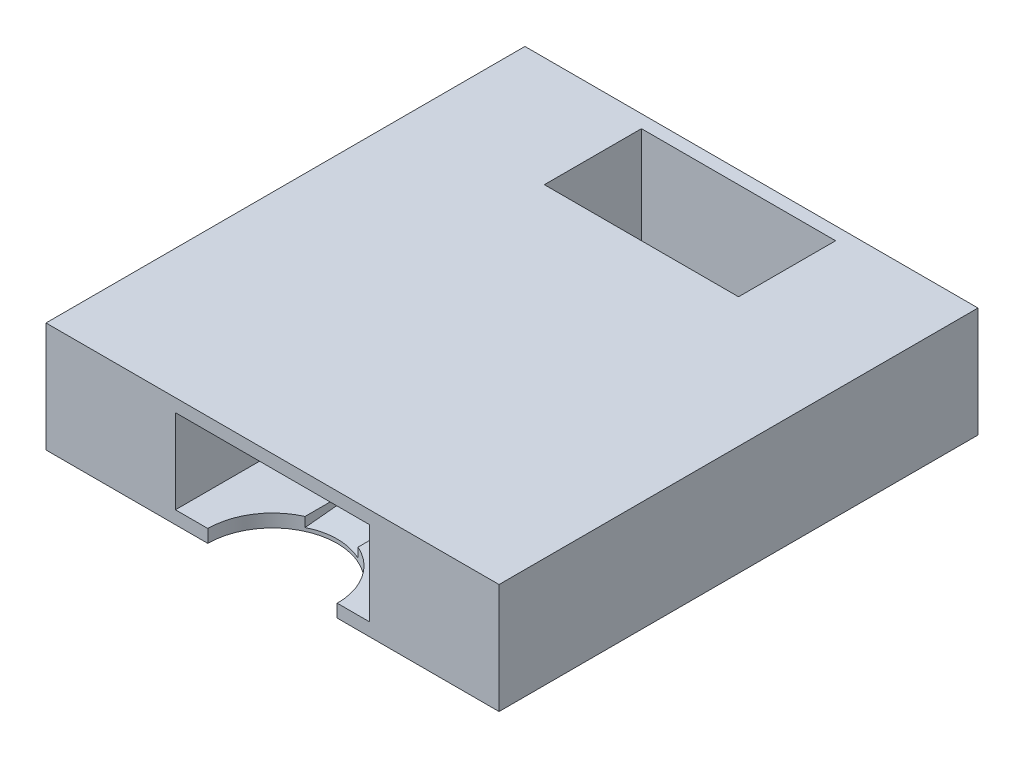
ISO-10303-21;
HEADER;
FILE_DESCRIPTION(('STEP AP214'),'2;1');
FILE_NAME('part.step','',(''),(''),'','','');
FILE_SCHEMA(('AUTOMOTIVE_DESIGN { 1 0 10303 214 1 1 1 1 }'));
ENDSEC;
DATA;
#1=APPLICATION_CONTEXT('core data for automotive mechanical design processes');
#2=APPLICATION_PROTOCOL_DEFINITION('international standard','automotive_design',2000,#1);
#3=PRODUCT_CONTEXT('',#1,'mechanical');
#4=PRODUCT('Part','Part','',(#3));
#5=PRODUCT_RELATED_PRODUCT_CATEGORY('part','',(#4));
#6=PRODUCT_DEFINITION_FORMATION('','',#4);
#7=PRODUCT_DEFINITION_CONTEXT('part definition',#1,'design');
#8=PRODUCT_DEFINITION('design','',#6,#7);
#9=PRODUCT_DEFINITION_SHAPE('','',#8);
#10=(LENGTH_UNIT() NAMED_UNIT(*) SI_UNIT(.MILLI.,.METRE.));
#11=(NAMED_UNIT(*) PLANE_ANGLE_UNIT() SI_UNIT($,.RADIAN.));
#12=(NAMED_UNIT(*) SI_UNIT($,.STERADIAN.) SOLID_ANGLE_UNIT());
#13=UNCERTAINTY_MEASURE_WITH_UNIT(LENGTH_MEASURE(1.E-05),#10,'distance_accuracy_value','');
#14=(GEOMETRIC_REPRESENTATION_CONTEXT(3) GLOBAL_UNCERTAINTY_ASSIGNED_CONTEXT((#13)) GLOBAL_UNIT_ASSIGNED_CONTEXT((#10,
#11,#12)) REPRESENTATION_CONTEXT('',''));
#15=CARTESIAN_POINT('',(0.,0.,0.));
#16=DIRECTION('',(0.,0.,1.));
#17=DIRECTION('',(1.,0.,0.));
#18=AXIS2_PLACEMENT_3D('',#15,#16,#17);
#19=CARTESIAN_POINT('',(-35.,15.,50.));
#20=DIRECTION('',(1.,0.,0.));
#21=DIRECTION('',(0.,0.,-1.));
#22=AXIS2_PLACEMENT_3D('',#19,#20,#21);
#23=PLANE('',#22);
#24=DIRECTION('',(0.,1.,0.));
#25=VECTOR('',#24,1.);
#26=CARTESIAN_POINT('',(-35.,0.,-24.));
#27=LINE('',#26,#25);
#28=CARTESIAN_POINT('',(-35.,0.,-24.));
#29=VERTEX_POINT('',#28);
#30=CARTESIAN_POINT('',(-35.,17.,-24.));
#31=VERTEX_POINT('',#30);
#32=EDGE_CURVE('E53',#29,#31,#27,.T.);
#33=ORIENTED_EDGE('',*,*,#32,.F.);
#34=DIRECTION('',(0.,0.,1.));
#35=VECTOR('',#34,1.);
#36=CARTESIAN_POINT('',(-35.,0.,50.));
#37=LINE('',#36,#35);
#38=CARTESIAN_POINT('',(-35.,0.,50.));
#39=VERTEX_POINT('',#38);
#40=EDGE_CURVE('E189',#29,#39,#37,.T.);
#41=ORIENTED_EDGE('',*,*,#40,.T.);
#42=DIRECTION('',(0.,-1.,0.));
#43=VECTOR('',#42,1.);
#44=CARTESIAN_POINT('',(-35.,15.,50.));
#45=LINE('',#44,#43);
#46=CARTESIAN_POINT('',(-35.,17.,50.));
#47=VERTEX_POINT('',#46);
#48=EDGE_CURVE('E206',#47,#39,#45,.T.);
#49=ORIENTED_EDGE('',*,*,#48,.F.);
#50=DIRECTION('',(0.,0.,1.));
#51=VECTOR('',#50,1.);
#52=CARTESIAN_POINT('',(-35.,17.,-6.99999999999998));
#53=LINE('',#52,#51);
#54=EDGE_CURVE('E188',#31,#47,#53,.T.);
#55=ORIENTED_EDGE('',*,*,#54,.F.);
#56=EDGE_LOOP('',(#33,#41,#49,#55));
#57=FACE_BOUND('',#56,.T.);
#58=ADVANCED_FACE('F39',(#57),#23,.F.);
#59=CARTESIAN_POINT('',(0.,0.,0.));
#60=DIRECTION('',(0.,-1.,0.));
#61=DIRECTION('',(0.,0.,-1.));
#62=AXIS2_PLACEMENT_3D('',#59,#60,#61);
#63=PLANE('',#62);
#64=DIRECTION('',(0.,0.,-1.));
#65=VECTOR('',#64,1.);
#66=CARTESIAN_POINT('',(4.5,0.,34.2618690071711));
#67=LINE('',#66,#65);
#68=CARTESIAN_POINT('',(4.5,0.,35.8618690071711));
#69=VERTEX_POINT('',#68);
#70=CARTESIAN_POINT('',(4.5,0.,34.2618690071711));
#71=VERTEX_POINT('',#70);
#72=EDGE_CURVE('E284',#69,#71,#67,.T.);
#73=ORIENTED_EDGE('',*,*,#72,.T.);
#74=DIRECTION('',(-1.,0.,0.));
#75=VECTOR('',#74,1.);
#76=CARTESIAN_POINT('',(-4.5,0.,34.2618690071711));
#77=LINE('',#76,#75);
#78=CARTESIAN_POINT('',(-4.5,0.,34.2618690071711));
#79=VERTEX_POINT('',#78);
#80=EDGE_CURVE('E297',#71,#79,#77,.T.);
#81=ORIENTED_EDGE('',*,*,#80,.T.);
#82=DIRECTION('',(0.,0.,1.));
#83=VECTOR('',#82,1.);
#84=CARTESIAN_POINT('',(-4.5,0.,34.2618690071711));
#85=LINE('',#84,#83);
#86=CARTESIAN_POINT('',(-4.5,0.,35.8618690071711));
#87=VERTEX_POINT('',#86);
#88=EDGE_CURVE('E300',#79,#87,#85,.T.);
#89=ORIENTED_EDGE('',*,*,#88,.T.);
#90=DIRECTION('',(1.,0.,0.));
#91=VECTOR('',#90,1.);
#92=CARTESIAN_POINT('',(-4.5,0.,35.8618690071711));
#93=LINE('',#92,#91);
#94=EDGE_CURVE('E280',#87,#69,#93,.T.);
#95=ORIENTED_EDGE('',*,*,#94,.T.);
#96=EDGE_LOOP('',(#73,#81,#89,#95));
#97=FACE_BOUND('',#96,.T.);
#98=ORIENTED_EDGE('',*,*,#40,.F.);
#99=DIRECTION('',(1.,0.,0.));
#100=VECTOR('',#99,1.);
#101=CARTESIAN_POINT('',(-35.,0.,-24.));
#102=LINE('',#101,#100);
#103=CARTESIAN_POINT('',(35.,0.,-24.));
#104=VERTEX_POINT('',#103);
#105=EDGE_CURVE('E174',#29,#104,#102,.T.);
#106=ORIENTED_EDGE('',*,*,#105,.T.);
#107=DIRECTION('',(0.,0.,-1.));
#108=VECTOR('',#107,1.);
#109=CARTESIAN_POINT('',(35.,0.,50.));
#110=LINE('',#109,#108);
#111=CARTESIAN_POINT('',(35.,0.,50.));
#112=VERTEX_POINT('',#111);
#113=EDGE_CURVE('E197',#112,#104,#110,.T.);
#114=ORIENTED_EDGE('',*,*,#113,.F.);
#115=DIRECTION('',(1.,0.,0.));
#116=VECTOR('',#115,1.);
#117=CARTESIAN_POINT('',(-35.,0.,50.));
#118=LINE('',#117,#116);
#119=CARTESIAN_POINT('',(10.,0.,50.));
#120=VERTEX_POINT('',#119);
#121=EDGE_CURVE('E200',#120,#112,#118,.T.);
#122=ORIENTED_EDGE('',*,*,#121,.F.);
#123=CARTESIAN_POINT('',(0.,0.,50.));
#124=DIRECTION('',(0.,-1.,0.));
#125=DIRECTION('',(0.,0.,1.));
#126=AXIS2_PLACEMENT_3D('',#123,#124,#125);
#127=CIRCLE('',#126,10.);
#128=CARTESIAN_POINT('',(-10.,0.,50.));
#129=VERTEX_POINT('',#128);
#130=EDGE_CURVE('E266',#129,#120,#127,.T.);
#131=ORIENTED_EDGE('',*,*,#130,.F.);
#132=EDGE_CURVE('E196',#39,#129,#118,.T.);
#133=ORIENTED_EDGE('',*,*,#132,.F.);
#134=EDGE_LOOP('',(#98,#106,#114,#122,#131,#133));
#135=FACE_BOUND('',#134,.T.);
#136=ADVANCED_FACE('F194',(#97,#135),#63,.T.);
#137=CARTESIAN_POINT('',(0.,0.,-22.));
#138=DIRECTION('',(0.,0.,1.));
#139=DIRECTION('',(1.,0.,0.));
#140=AXIS2_PLACEMENT_3D('',#137,#138,#139);
#141=PLANE('',#140);
#142=DIRECTION('',(1.,0.,0.));
#143=VECTOR('',#142,1.);
#144=CARTESIAN_POINT('',(-35.,17.,-22.));
#145=LINE('',#144,#143);
#146=CARTESIAN_POINT('',(-15.,17.,-22.));
#147=VERTEX_POINT('',#146);
#148=CARTESIAN_POINT('',(15.,17.,-22.));
#149=VERTEX_POINT('',#148);
#150=EDGE_CURVE('E322',#147,#149,#145,.T.);
#151=ORIENTED_EDGE('',*,*,#150,.F.);
#152=DIRECTION('',(0.,-1.,0.));
#153=VECTOR('',#152,1.);
#154=CARTESIAN_POINT('',(-15.,2.,-22.));
#155=LINE('',#154,#153);
#156=CARTESIAN_POINT('',(-15.,2.,-22.));
#157=VERTEX_POINT('',#156);
#158=EDGE_CURVE('E65',#147,#157,#155,.T.);
#159=ORIENTED_EDGE('',*,*,#158,.T.);
#160=DIRECTION('',(1.,0.,0.));
#161=VECTOR('',#160,1.);
#162=CARTESIAN_POINT('',(-15.,2.,-22.));
#163=LINE('',#162,#161);
#164=CARTESIAN_POINT('',(15.,2.00000000000001,-22.));
#165=VERTEX_POINT('',#164);
#166=EDGE_CURVE('E252',#157,#165,#163,.T.);
#167=ORIENTED_EDGE('',*,*,#166,.T.);
#168=DIRECTION('',(0.,1.,0.));
#169=VECTOR('',#168,1.);
#170=CARTESIAN_POINT('',(15.,15.,-22.));
#171=LINE('',#170,#169);
#172=EDGE_CURVE('E240',#165,#149,#171,.T.);
#173=ORIENTED_EDGE('',*,*,#172,.T.);
#174=EDGE_LOOP('',(#151,#159,#167,#173));
#175=FACE_BOUND('',#174,.T.);
#176=ADVANCED_FACE('F361',(#175),#141,.T.);
#177=CARTESIAN_POINT('',(35.,17.,-6.99999999999999));
#178=DIRECTION('',(0.,0.,1.));
#179=DIRECTION('',(1.,0.,0.));
#180=AXIS2_PLACEMENT_3D('',#177,#178,#179);
#181=PLANE('',#180);
#182=DIRECTION('',(0.,-1.,0.));
#183=VECTOR('',#182,1.);
#184=CARTESIAN_POINT('',(-15.,17.,-6.99999999999999));
#185=LINE('',#184,#183);
#186=CARTESIAN_POINT('',(-15.,17.,-6.99999999999999));
#187=VERTEX_POINT('',#186);
#188=CARTESIAN_POINT('',(-15.,15.,-6.99999999999999));
#189=VERTEX_POINT('',#188);
#190=EDGE_CURVE('E323',#187,#189,#185,.T.);
#191=ORIENTED_EDGE('',*,*,#190,.F.);
#192=DIRECTION('',(-1.,0.,0.));
#193=VECTOR('',#192,1.);
#194=CARTESIAN_POINT('',(35.,17.,-6.99999999999999));
#195=LINE('',#194,#193);
#196=CARTESIAN_POINT('',(15.,17.,-6.99999999999999));
#197=VERTEX_POINT('',#196);
#198=EDGE_CURVE('E316',#197,#187,#195,.T.);
#199=ORIENTED_EDGE('',*,*,#198,.F.);
#200=DIRECTION('',(0.,-1.,0.));
#201=VECTOR('',#200,1.);
#202=CARTESIAN_POINT('',(15.,17.,-6.99999999999999));
#203=LINE('',#202,#201);
#204=CARTESIAN_POINT('',(15.,15.,-6.99999999999999));
#205=VERTEX_POINT('',#204);
#206=EDGE_CURVE('E342',#197,#205,#203,.T.);
#207=ORIENTED_EDGE('',*,*,#206,.T.);
#208=DIRECTION('',(-1.,0.,0.));
#209=VECTOR('',#208,1.);
#210=CARTESIAN_POINT('',(35.,15.,-6.99999999999999));
#211=LINE('',#210,#209);
#212=EDGE_CURVE('E326',#205,#189,#211,.T.);
#213=ORIENTED_EDGE('',*,*,#212,.T.);
#214=EDGE_LOOP('',(#191,#199,#207,#213));
#215=FACE_BOUND('',#214,.T.);
#216=ADVANCED_FACE('F368',(#215),#181,.F.);
#217=CARTESIAN_POINT('',(0.,72.,50.));
#218=DIRECTION('',(0.,-1.,0.));
#219=DIRECTION('',(0.,0.,-1.));
#220=AXIS2_PLACEMENT_3D('',#217,#218,#219);
#221=CYLINDRICAL_SURFACE('',#220,10.);
#222=DIRECTION('',(0.,-1.,0.));
#223=VECTOR('',#222,1.);
#224=CARTESIAN_POINT('',(4.1,72.,40.8791447769412));
#225=LINE('',#224,#223);
#226=CARTESIAN_POINT('',(4.1,2.,40.8791447769412));
#227=VERTEX_POINT('',#226);
#228=CARTESIAN_POINT('',(4.1,0.510423286294755,40.8791447769412));
#229=VERTEX_POINT('',#228);
#230=EDGE_CURVE('E213',#227,#229,#225,.T.);
#231=ORIENTED_EDGE('',*,*,#230,.T.);
#232=CARTESIAN_POINT('',(0.,-0.379573303725469,50.));
#233=DIRECTION('',(0.,0.995272977540471,0.0971169407349985));
#234=DIRECTION('',(0.,-0.0971169407349985,0.995272977540471));
#235=AXIS2_PLACEMENT_3D('',#232,#233,#234);
#236=ELLIPSE('',#235,10.0474947332662,10.);
#237=CARTESIAN_POINT('',(-4.1,0.510423286294751,40.8791447769412));
#238=VERTEX_POINT('',#237);
#239=EDGE_CURVE('E11',#238,#229,#236,.F.);
#240=ORIENTED_EDGE('',*,*,#239,.F.);
#241=DIRECTION('',(0.,-1.,0.));
#242=VECTOR('',#241,1.);
#243=CARTESIAN_POINT('',(-4.10000000000003,72.,40.8791447769411));
#244=LINE('',#243,#242);
#245=CARTESIAN_POINT('',(-4.10000000000003,2.,40.8791447769411));
#246=VERTEX_POINT('',#245);
#247=EDGE_CURVE('E50',#238,#246,#244,.F.);
#248=ORIENTED_EDGE('',*,*,#247,.T.);
#249=CARTESIAN_POINT('',(0.,2.,50.));
#250=DIRECTION('',(0.,-1.,0.));
#251=DIRECTION('',(1.,0.,0.));
#252=AXIS2_PLACEMENT_3D('',#249,#250,#251);
#253=CIRCLE('',#252,10.);
#254=CARTESIAN_POINT('',(-10.,2.,50.));
#255=VERTEX_POINT('',#254);
#256=EDGE_CURVE('E212',#255,#246,#253,.T.);
#257=ORIENTED_EDGE('',*,*,#256,.F.);
#258=DIRECTION('',(0.,-1.,0.));
#259=VECTOR('',#258,1.);
#260=CARTESIAN_POINT('',(-10.,72.,50.));
#261=LINE('',#260,#259);
#262=EDGE_CURVE('E265',#255,#129,#261,.T.);
#263=ORIENTED_EDGE('',*,*,#262,.T.);
#264=ORIENTED_EDGE('',*,*,#130,.T.);
#265=DIRECTION('',(0.,-1.,0.));
#266=VECTOR('',#265,1.);
#267=CARTESIAN_POINT('',(10.,72.,50.));
#268=LINE('',#267,#266);
#269=CARTESIAN_POINT('',(9.99999999999998,2.,50.));
#270=VERTEX_POINT('',#269);
#271=EDGE_CURVE('E264',#270,#120,#268,.T.);
#272=ORIENTED_EDGE('',*,*,#271,.F.);
#273=EDGE_CURVE('E208',#227,#270,#253,.T.);
#274=ORIENTED_EDGE('',*,*,#273,.F.);
#275=EDGE_LOOP('',(#231,#240,#248,#257,#263,#264,#272,#274));
#276=FACE_BOUND('',#275,.T.);
#277=ADVANCED_FACE('F218',(#276),#221,.F.);
#278=CARTESIAN_POINT('',(-4.5,0.,35.8618690071711));
#279=DIRECTION('',(0.,0.,1.));
#280=DIRECTION('',(1.,0.,0.));
#281=AXIS2_PLACEMENT_3D('',#278,#279,#280);
#282=PLANE('',#281);
#283=DIRECTION('',(0.,1.,0.));
#284=VECTOR('',#283,1.);
#285=CARTESIAN_POINT('',(-4.1,3.,35.8618690071711));
#286=LINE('',#285,#284);
#287=CARTESIAN_POINT('',(-4.1,1.,35.8618690071711));
#288=VERTEX_POINT('',#287);
#289=CARTESIAN_POINT('',(-4.1,2.,35.8618690071711));
#290=VERTEX_POINT('',#289);
#291=EDGE_CURVE('E315',#288,#290,#286,.T.);
#292=ORIENTED_EDGE('',*,*,#291,.F.);
#293=DIRECTION('',(-1.,0.,0.));
#294=VECTOR('',#293,1.);
#295=CARTESIAN_POINT('',(4.1,1.,35.8618690071711));
#296=LINE('',#295,#294);
#297=CARTESIAN_POINT('',(4.1,1.,35.8618690071711));
#298=VERTEX_POINT('',#297);
#299=EDGE_CURVE('E307',#298,#288,#296,.T.);
#300=ORIENTED_EDGE('',*,*,#299,.F.);
#301=DIRECTION('',(0.,-1.,0.));
#302=VECTOR('',#301,1.);
#303=CARTESIAN_POINT('',(4.1,3.,35.8618690071711));
#304=LINE('',#303,#302);
#305=CARTESIAN_POINT('',(4.1,2.,35.8618690071711));
#306=VERTEX_POINT('',#305);
#307=EDGE_CURVE('E211',#306,#298,#304,.T.);
#308=ORIENTED_EDGE('',*,*,#307,.F.);
#309=DIRECTION('',(1.,0.,0.));
#310=VECTOR('',#309,1.);
#311=CARTESIAN_POINT('',(-4.5,2.,35.8618690071711));
#312=LINE('',#311,#310);
#313=CARTESIAN_POINT('',(4.5,2.,35.8618690071711));
#314=VERTEX_POINT('',#313);
#315=EDGE_CURVE('E288',#306,#314,#312,.T.);
#316=ORIENTED_EDGE('',*,*,#315,.T.);
#317=DIRECTION('',(0.,1.,0.));
#318=VECTOR('',#317,1.);
#319=CARTESIAN_POINT('',(4.5,0.,35.8618690071711));
#320=LINE('',#319,#318);
#321=EDGE_CURVE('E275',#69,#314,#320,.T.);
#322=ORIENTED_EDGE('',*,*,#321,.F.);
#323=ORIENTED_EDGE('',*,*,#94,.F.);
#324=DIRECTION('',(0.,1.,0.));
#325=VECTOR('',#324,1.);
#326=CARTESIAN_POINT('',(-4.5,0.,35.8618690071711));
#327=LINE('',#326,#325);
#328=CARTESIAN_POINT('',(-4.5,2.,35.8618690071711));
#329=VERTEX_POINT('',#328);
#330=EDGE_CURVE('E276',#87,#329,#327,.T.);
#331=ORIENTED_EDGE('',*,*,#330,.T.);
#332=EDGE_CURVE('E282',#329,#290,#312,.T.);
#333=ORIENTED_EDGE('',*,*,#332,.T.);
#334=EDGE_LOOP('',(#292,#300,#308,#316,#322,#323,#331,#333));
#335=FACE_BOUND('',#334,.T.);
#336=ADVANCED_FACE('F391',(#335),#282,.F.);
#337=CARTESIAN_POINT('',(-35.,15.,50.));
#338=DIRECTION('',(0.,0.,-1.));
#339=DIRECTION('',(-1.,0.,0.));
#340=AXIS2_PLACEMENT_3D('',#337,#338,#339);
#341=PLANE('',#340);
#342=DIRECTION('',(1.,0.,0.));
#343=VECTOR('',#342,1.);
#344=CARTESIAN_POINT('',(-15.,2.,50.));
#345=LINE('',#344,#343);
#346=CARTESIAN_POINT('',(15.,2.00000000000001,50.));
#347=VERTEX_POINT('',#346);
#348=EDGE_CURVE('E238',#270,#347,#345,.T.);
#349=ORIENTED_EDGE('',*,*,#348,.F.);
#350=ORIENTED_EDGE('',*,*,#271,.T.);
#351=ORIENTED_EDGE('',*,*,#121,.T.);
#352=DIRECTION('',(0.,-1.,0.));
#353=VECTOR('',#352,1.);
#354=CARTESIAN_POINT('',(35.,15.,50.));
#355=LINE('',#354,#353);
#356=CARTESIAN_POINT('',(35.,17.,50.));
#357=VERTEX_POINT('',#356);
#358=EDGE_CURVE('E202',#357,#112,#355,.T.);
#359=ORIENTED_EDGE('',*,*,#358,.F.);
#360=DIRECTION('',(1.,0.,0.));
#361=VECTOR('',#360,1.);
#362=CARTESIAN_POINT('',(-35.,17.,50.));
#363=LINE('',#362,#361);
#364=EDGE_CURVE('E334',#47,#357,#363,.T.);
#365=ORIENTED_EDGE('',*,*,#364,.F.);
#366=ORIENTED_EDGE('',*,*,#48,.T.);
#367=ORIENTED_EDGE('',*,*,#132,.T.);
#368=ORIENTED_EDGE('',*,*,#262,.F.);
#369=CARTESIAN_POINT('',(-15.,2.,50.));
#370=VERTEX_POINT('',#369);
#371=EDGE_CURVE('E233',#370,#255,#345,.T.);
#372=ORIENTED_EDGE('',*,*,#371,.F.);
#373=DIRECTION('',(0.,-1.,0.));
#374=VECTOR('',#373,1.);
#375=CARTESIAN_POINT('',(-15.,2.,50.));
#376=LINE('',#375,#374);
#377=CARTESIAN_POINT('',(-15.,15.,50.));
#378=VERTEX_POINT('',#377);
#379=EDGE_CURVE('E241',#378,#370,#376,.T.);
#380=ORIENTED_EDGE('',*,*,#379,.F.);
#381=DIRECTION('',(1.,0.,0.));
#382=VECTOR('',#381,1.);
#383=CARTESIAN_POINT('',(-35.,15.,50.));
#384=LINE('',#383,#382);
#385=CARTESIAN_POINT('',(15.,15.,50.));
#386=VERTEX_POINT('',#385);
#387=EDGE_CURVE('E321',#378,#386,#384,.T.);
#388=ORIENTED_EDGE('',*,*,#387,.T.);
#389=DIRECTION('',(0.,1.,0.));
#390=VECTOR('',#389,1.);
#391=CARTESIAN_POINT('',(15.,15.,50.));
#392=LINE('',#391,#390);
#393=EDGE_CURVE('E261',#347,#386,#392,.T.);
#394=ORIENTED_EDGE('',*,*,#393,.F.);
#395=EDGE_LOOP('',(#349,#350,#351,#359,#365,#366,#367,#368,#372,#380,#388,#394));
#396=FACE_BOUND('',#395,.T.);
#397=ADVANCED_FACE('F352',(#396),#341,.F.);
#398=CARTESIAN_POINT('',(35.,15.,50.));
#399=DIRECTION('',(-1.,0.,0.));
#400=DIRECTION('',(0.,0.,1.));
#401=AXIS2_PLACEMENT_3D('',#398,#399,#400);
#402=PLANE('',#401);
#403=ORIENTED_EDGE('',*,*,#113,.T.);
#404=DIRECTION('',(0.,1.,0.));
#405=VECTOR('',#404,1.);
#406=CARTESIAN_POINT('',(35.,0.,-24.));
#407=LINE('',#406,#405);
#408=CARTESIAN_POINT('',(35.,17.,-24.));
#409=VERTEX_POINT('',#408);
#410=EDGE_CURVE('E178',#104,#409,#407,.T.);
#411=ORIENTED_EDGE('',*,*,#410,.T.);
#412=DIRECTION('',(0.,0.,-1.));
#413=VECTOR('',#412,1.);
#414=CARTESIAN_POINT('',(35.,17.,50.));
#415=LINE('',#414,#413);
#416=EDGE_CURVE('E333',#357,#409,#415,.T.);
#417=ORIENTED_EDGE('',*,*,#416,.F.);
#418=ORIENTED_EDGE('',*,*,#358,.T.);
#419=EDGE_LOOP('',(#403,#411,#417,#418));
#420=FACE_BOUND('',#419,.T.);
#421=ADVANCED_FACE('F41',(#420),#402,.F.);
#422=CARTESIAN_POINT('',(15.,15.,-22.));
#423=DIRECTION('',(1.,0.,0.));
#424=DIRECTION('',(0.,1.,0.));
#425=AXIS2_PLACEMENT_3D('',#422,#423,#424);
#426=PLANE('',#425);
#427=ORIENTED_EDGE('',*,*,#393,.T.);
#428=DIRECTION('',(0.,0.,1.));
#429=VECTOR('',#428,1.);
#430=CARTESIAN_POINT('',(15.,15.,-22.));
#431=LINE('',#430,#429);
#432=EDGE_CURVE('E248',#205,#386,#431,.T.);
#433=ORIENTED_EDGE('',*,*,#432,.F.);
#434=ORIENTED_EDGE('',*,*,#206,.F.);
#435=DIRECTION('',(0.,0.,1.));
#436=VECTOR('',#435,1.);
#437=CARTESIAN_POINT('',(15.,17.,-22.));
#438=LINE('',#437,#436);
#439=EDGE_CURVE('E336',#149,#197,#438,.T.);
#440=ORIENTED_EDGE('',*,*,#439,.F.);
#441=ORIENTED_EDGE('',*,*,#172,.F.);
#442=DIRECTION('',(0.,0.,1.));
#443=VECTOR('',#442,1.);
#444=CARTESIAN_POINT('',(15.,2.00000000000001,-22.));
#445=LINE('',#444,#443);
#446=EDGE_CURVE('E203',#165,#347,#445,.T.);
#447=ORIENTED_EDGE('',*,*,#446,.T.);
#448=EDGE_LOOP('',(#427,#433,#434,#440,#441,#447));
#449=FACE_BOUND('',#448,.T.);
#450=ADVANCED_FACE('F359',(#449),#426,.F.);
#451=CARTESIAN_POINT('',(-15.,2.,-22.));
#452=DIRECTION('',(0.,-1.,0.));
#453=DIRECTION('',(1.,0.,0.));
#454=AXIS2_PLACEMENT_3D('',#451,#452,#453);
#455=PLANE('',#454);
#456=ORIENTED_EDGE('',*,*,#256,.T.);
#457=DIRECTION('',(0.,0.,-1.));
#458=VECTOR('',#457,1.);
#459=CARTESIAN_POINT('',(-4.1,2.,-22.));
#460=LINE('',#459,#458);
#461=EDGE_CURVE('E226',#246,#290,#460,.T.);
#462=ORIENTED_EDGE('',*,*,#461,.T.);
#463=ORIENTED_EDGE('',*,*,#332,.F.);
#464=DIRECTION('',(0.,0.,1.));
#465=VECTOR('',#464,1.);
#466=CARTESIAN_POINT('',(-4.5,2.,34.2618690071711));
#467=LINE('',#466,#465);
#468=CARTESIAN_POINT('',(-4.5,2.,34.2618690071711));
#469=VERTEX_POINT('',#468);
#470=EDGE_CURVE('E290',#469,#329,#467,.T.);
#471=ORIENTED_EDGE('',*,*,#470,.F.);
#472=DIRECTION('',(-1.,0.,0.));
#473=VECTOR('',#472,1.);
#474=CARTESIAN_POINT('',(-4.5,2.,34.2618690071711));
#475=LINE('',#474,#473);
#476=CARTESIAN_POINT('',(4.5,2.,34.2618690071711));
#477=VERTEX_POINT('',#476);
#478=EDGE_CURVE('E287',#477,#469,#475,.T.);
#479=ORIENTED_EDGE('',*,*,#478,.F.);
#480=DIRECTION('',(0.,0.,-1.));
#481=VECTOR('',#480,1.);
#482=CARTESIAN_POINT('',(4.5,2.,34.2618690071711));
#483=LINE('',#482,#481);
#484=EDGE_CURVE('E291',#314,#477,#483,.T.);
#485=ORIENTED_EDGE('',*,*,#484,.F.);
#486=ORIENTED_EDGE('',*,*,#315,.F.);
#487=DIRECTION('',(0.,0.,1.));
#488=VECTOR('',#487,1.);
#489=CARTESIAN_POINT('',(4.1,2.,-22.));
#490=LINE('',#489,#488);
#491=EDGE_CURVE('E306',#306,#227,#490,.T.);
#492=ORIENTED_EDGE('',*,*,#491,.T.);
#493=ORIENTED_EDGE('',*,*,#273,.T.);
#494=ORIENTED_EDGE('',*,*,#348,.T.);
#495=ORIENTED_EDGE('',*,*,#446,.F.);
#496=ORIENTED_EDGE('',*,*,#166,.F.);
#497=DIRECTION('',(0.,0.,1.));
#498=VECTOR('',#497,1.);
#499=CARTESIAN_POINT('',(-15.,2.,-22.));
#500=LINE('',#499,#498);
#501=EDGE_CURVE('E231',#157,#370,#500,.T.);
#502=ORIENTED_EDGE('',*,*,#501,.T.);
#503=ORIENTED_EDGE('',*,*,#371,.T.);
#504=EDGE_LOOP('',(#456,#462,#463,#471,#479,#485,#486,#492,#493,#494,#495,#496,#502,#503));
#505=FACE_BOUND('',#504,.T.);
#506=ADVANCED_FACE('F228',(#505),#455,.F.);
#507=CARTESIAN_POINT('',(-15.,2.,-22.));
#508=DIRECTION('',(-1.,0.,0.));
#509=DIRECTION('',(0.,0.,1.));
#510=AXIS2_PLACEMENT_3D('',#507,#508,#509);
#511=PLANE('',#510);
#512=ORIENTED_EDGE('',*,*,#379,.T.);
#513=ORIENTED_EDGE('',*,*,#501,.F.);
#514=ORIENTED_EDGE('',*,*,#158,.F.);
#515=DIRECTION('',(0.,0.,-1.));
#516=VECTOR('',#515,1.);
#517=CARTESIAN_POINT('',(-15.,17.,-22.));
#518=LINE('',#517,#516);
#519=EDGE_CURVE('E338',#187,#147,#518,.T.);
#520=ORIENTED_EDGE('',*,*,#519,.F.);
#521=ORIENTED_EDGE('',*,*,#190,.T.);
#522=DIRECTION('',(0.,0.,1.));
#523=VECTOR('',#522,1.);
#524=CARTESIAN_POINT('',(-15.,15.,-22.));
#525=LINE('',#524,#523);
#526=EDGE_CURVE('E247',#189,#378,#525,.T.);
#527=ORIENTED_EDGE('',*,*,#526,.T.);
#528=EDGE_LOOP('',(#512,#513,#514,#520,#521,#527));
#529=FACE_BOUND('',#528,.T.);
#530=ADVANCED_FACE('F362',(#529),#511,.F.);
#531=CARTESIAN_POINT('',(4.5,0.,34.2618690071711));
#532=DIRECTION('',(1.,0.,0.));
#533=DIRECTION('',(0.,1.,0.));
#534=AXIS2_PLACEMENT_3D('',#531,#532,#533);
#535=PLANE('',#534);
#536=ORIENTED_EDGE('',*,*,#484,.T.);
#537=DIRECTION('',(0.,1.,0.));
#538=VECTOR('',#537,1.);
#539=CARTESIAN_POINT('',(4.5,0.,34.2618690071711));
#540=LINE('',#539,#538);
#541=EDGE_CURVE('E271',#71,#477,#540,.T.);
#542=ORIENTED_EDGE('',*,*,#541,.F.);
#543=ORIENTED_EDGE('',*,*,#72,.F.);
#544=ORIENTED_EDGE('',*,*,#321,.T.);
#545=EDGE_LOOP('',(#536,#542,#543,#544));
#546=FACE_BOUND('',#545,.T.);
#547=ADVANCED_FACE('F398',(#546),#535,.F.);
#548=CARTESIAN_POINT('',(-4.5,0.,34.2618690071711));
#549=DIRECTION('',(-1.,0.,0.));
#550=DIRECTION('',(0.,-1.,0.));
#551=AXIS2_PLACEMENT_3D('',#548,#549,#550);
#552=PLANE('',#551);
#553=ORIENTED_EDGE('',*,*,#470,.T.);
#554=ORIENTED_EDGE('',*,*,#330,.F.);
#555=ORIENTED_EDGE('',*,*,#88,.F.);
#556=DIRECTION('',(0.,1.,0.));
#557=VECTOR('',#556,1.);
#558=CARTESIAN_POINT('',(-4.5,0.,34.2618690071711));
#559=LINE('',#558,#557);
#560=EDGE_CURVE('E277',#79,#469,#559,.T.);
#561=ORIENTED_EDGE('',*,*,#560,.T.);
#562=EDGE_LOOP('',(#553,#554,#555,#561));
#563=FACE_BOUND('',#562,.T.);
#564=ADVANCED_FACE('F403',(#563),#552,.F.);
#565=CARTESIAN_POINT('',(-4.5,0.,34.2618690071711));
#566=DIRECTION('',(0.,0.,-1.));
#567=DIRECTION('',(-1.,0.,0.));
#568=AXIS2_PLACEMENT_3D('',#565,#566,#567);
#569=PLANE('',#568);
#570=ORIENTED_EDGE('',*,*,#478,.T.);
#571=ORIENTED_EDGE('',*,*,#560,.F.);
#572=ORIENTED_EDGE('',*,*,#80,.F.);
#573=ORIENTED_EDGE('',*,*,#541,.T.);
#574=EDGE_LOOP('',(#570,#571,#572,#573));
#575=FACE_BOUND('',#574,.T.);
#576=ADVANCED_FACE('F410',(#575),#569,.F.);
#577=CARTESIAN_POINT('',(-4.1,3.,50.));
#578=DIRECTION('',(-1.,0.,0.));
#579=DIRECTION('',(0.,-1.,0.));
#580=AXIS2_PLACEMENT_3D('',#577,#578,#579);
#581=PLANE('',#580);
#582=ORIENTED_EDGE('',*,*,#247,.F.);
#583=DIRECTION('',(0.,0.0971169407349985,-0.995272977540471));
#584=VECTOR('',#583,1.);
#585=CARTESIAN_POINT('',(-4.1,0.510423286294751,40.8791447769412));
#586=LINE('',#585,#584);
#587=EDGE_CURVE('E320',#238,#288,#586,.T.);
#588=ORIENTED_EDGE('',*,*,#587,.T.);
#589=ORIENTED_EDGE('',*,*,#291,.T.);
#590=ORIENTED_EDGE('',*,*,#461,.F.);
#591=EDGE_LOOP('',(#582,#588,#589,#590));
#592=FACE_BOUND('',#591,.T.);
#593=ADVANCED_FACE('F408',(#592),#581,.F.);
#594=CARTESIAN_POINT('',(4.1,3.,50.));
#595=DIRECTION('',(1.,0.,0.));
#596=DIRECTION('',(0.,0.,-1.));
#597=AXIS2_PLACEMENT_3D('',#594,#595,#596);
#598=PLANE('',#597);
#599=ORIENTED_EDGE('',*,*,#307,.T.);
#600=DIRECTION('',(0.,0.0971169407349985,-0.995272977540471));
#601=VECTOR('',#600,1.);
#602=CARTESIAN_POINT('',(4.1,0.510423286294755,40.8791447769412));
#603=LINE('',#602,#601);
#604=EDGE_CURVE('E317',#229,#298,#603,.T.);
#605=ORIENTED_EDGE('',*,*,#604,.F.);
#606=ORIENTED_EDGE('',*,*,#230,.F.);
#607=ORIENTED_EDGE('',*,*,#491,.F.);
#608=EDGE_LOOP('',(#599,#605,#606,#607));
#609=FACE_BOUND('',#608,.T.);
#610=ADVANCED_FACE('F379',(#609),#598,.F.);
#611=CARTESIAN_POINT('',(4.1,0.510423286294755,40.8791447769412));
#612=DIRECTION('',(0.,0.995272977540471,0.0971169407349985));
#613=DIRECTION('',(0.,-0.0971169407349985,0.995272977540471));
#614=AXIS2_PLACEMENT_3D('',#611,#612,#613);
#615=PLANE('',#614);
#616=ORIENTED_EDGE('',*,*,#239,.T.);
#617=ORIENTED_EDGE('',*,*,#604,.T.);
#618=ORIENTED_EDGE('',*,*,#299,.T.);
#619=ORIENTED_EDGE('',*,*,#587,.F.);
#620=EDGE_LOOP('',(#616,#617,#618,#619));
#621=FACE_BOUND('',#620,.T.);
#622=ADVANCED_FACE('F371',(#621),#615,.T.);
#623=CARTESIAN_POINT('',(0.,15.,0.));
#624=DIRECTION('',(0.,1.,0.));
#625=DIRECTION('',(0.,0.,1.));
#626=AXIS2_PLACEMENT_3D('',#623,#624,#625);
#627=PLANE('',#626);
#628=ORIENTED_EDGE('',*,*,#212,.F.);
#629=ORIENTED_EDGE('',*,*,#432,.T.);
#630=ORIENTED_EDGE('',*,*,#387,.F.);
#631=ORIENTED_EDGE('',*,*,#526,.F.);
#632=EDGE_LOOP('',(#628,#629,#630,#631));
#633=FACE_BOUND('',#632,.T.);
#634=ADVANCED_FACE('F367',(#633),#627,.F.);
#635=CARTESIAN_POINT('',(0.,17.,0.));
#636=DIRECTION('',(0.,1.,0.));
#637=DIRECTION('',(0.,0.,1.));
#638=AXIS2_PLACEMENT_3D('',#635,#636,#637);
#639=PLANE('',#638);
#640=DIRECTION('',(1.,0.,0.));
#641=VECTOR('',#640,1.);
#642=CARTESIAN_POINT('',(-35.,17.,-24.));
#643=LINE('',#642,#641);
#644=EDGE_CURVE('E182',#31,#409,#643,.T.);
#645=ORIENTED_EDGE('',*,*,#644,.F.);
#646=ORIENTED_EDGE('',*,*,#54,.T.);
#647=ORIENTED_EDGE('',*,*,#364,.T.);
#648=ORIENTED_EDGE('',*,*,#416,.T.);
#649=EDGE_LOOP('',(#645,#646,#647,#648));
#650=FACE_BOUND('',#649,.T.);
#651=ORIENTED_EDGE('',*,*,#519,.T.);
#652=ORIENTED_EDGE('',*,*,#150,.T.);
#653=ORIENTED_EDGE('',*,*,#439,.T.);
#654=ORIENTED_EDGE('',*,*,#198,.T.);
#655=EDGE_LOOP('',(#651,#652,#653,#654));
#656=FACE_BOUND('',#655,.T.);
#657=ADVANCED_FACE('F353',(#650,#656),#639,.T.);
#658=CARTESIAN_POINT('',(-35.,0.,-24.));
#659=DIRECTION('',(0.,0.,1.));
#660=DIRECTION('',(1.,0.,0.));
#661=AXIS2_PLACEMENT_3D('',#658,#659,#660);
#662=PLANE('',#661);
#663=ORIENTED_EDGE('',*,*,#644,.T.);
#664=ORIENTED_EDGE('',*,*,#410,.F.);
#665=ORIENTED_EDGE('',*,*,#105,.F.);
#666=ORIENTED_EDGE('',*,*,#32,.T.);
#667=EDGE_LOOP('',(#663,#664,#665,#666));
#668=FACE_BOUND('',#667,.T.);
#669=ADVANCED_FACE('F176',(#668),#662,.F.);
#670=CLOSED_SHELL('',(#58,#136,#176,#216,#277,#336,#397,#421,#450,#506,#530,#547,#564,#576,#593,
#610,#622,#634,#657,#669));
#671=MANIFOLD_SOLID_BREP('B2',#670);
#672=ADVANCED_BREP_SHAPE_REPRESENTATION('',(#18,#671),#14);
#673=SHAPE_DEFINITION_REPRESENTATION(#9,#672);
ENDSEC;
END-ISO-10303-21;
